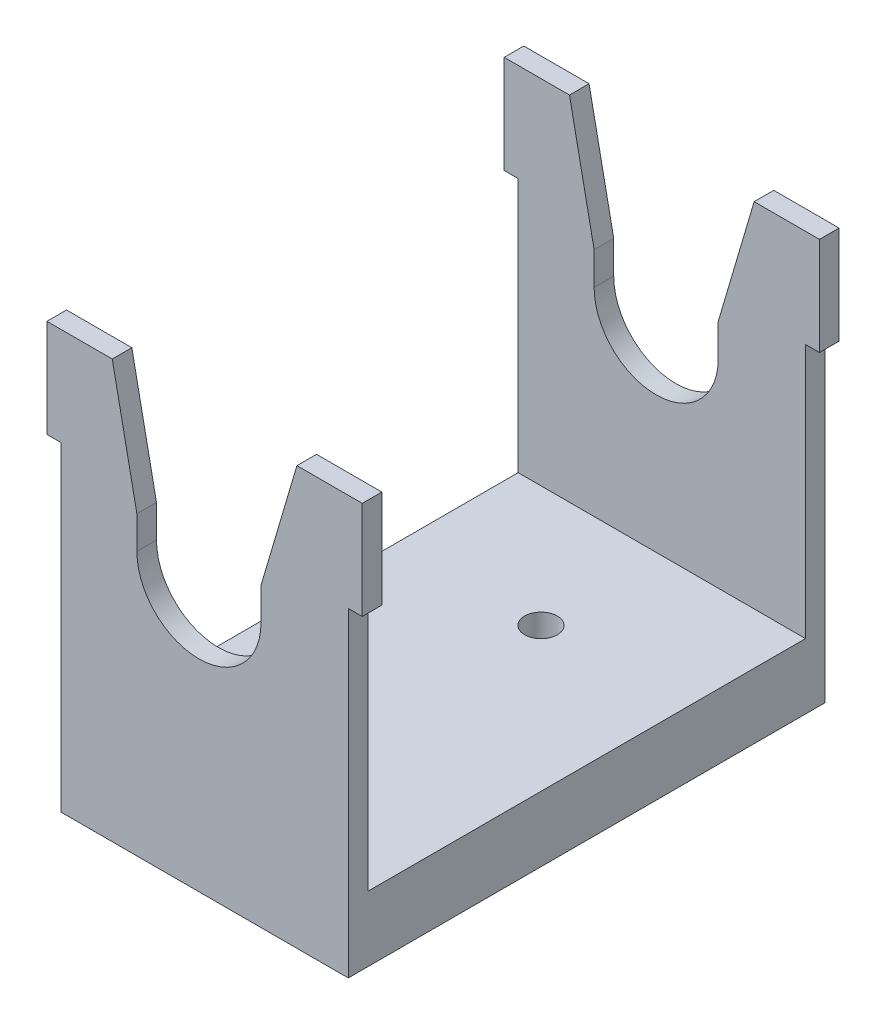
ISO-10303-21;
HEADER;
FILE_DESCRIPTION(('STEP AP214'),'2;1');
FILE_NAME('part.step','',(''),(''),'','','');
FILE_SCHEMA(('AUTOMOTIVE_DESIGN { 1 0 10303 214 1 1 1 1 }'));
ENDSEC;
DATA;
#1=APPLICATION_CONTEXT('core data for automotive mechanical design processes');
#2=APPLICATION_PROTOCOL_DEFINITION('international standard','automotive_design',2000,#1);
#3=PRODUCT_CONTEXT('',#1,'mechanical');
#4=PRODUCT('Part','Part','',(#3));
#5=PRODUCT_RELATED_PRODUCT_CATEGORY('part','',(#4));
#6=PRODUCT_DEFINITION_FORMATION('','',#4);
#7=PRODUCT_DEFINITION_CONTEXT('part definition',#1,'design');
#8=PRODUCT_DEFINITION('design','',#6,#7);
#9=PRODUCT_DEFINITION_SHAPE('','',#8);
#10=(LENGTH_UNIT() NAMED_UNIT(*) SI_UNIT(.MILLI.,.METRE.));
#11=(NAMED_UNIT(*) PLANE_ANGLE_UNIT() SI_UNIT($,.RADIAN.));
#12=(NAMED_UNIT(*) SI_UNIT($,.STERADIAN.) SOLID_ANGLE_UNIT());
#13=UNCERTAINTY_MEASURE_WITH_UNIT(LENGTH_MEASURE(1.E-05),#10,'distance_accuracy_value','');
#14=(GEOMETRIC_REPRESENTATION_CONTEXT(3) GLOBAL_UNCERTAINTY_ASSIGNED_CONTEXT((#13)) GLOBAL_UNIT_ASSIGNED_CONTEXT((#10,
#11,#12)) REPRESENTATION_CONTEXT('',''));
#15=CARTESIAN_POINT('',(0.,0.,0.));
#16=DIRECTION('',(0.,0.,1.));
#17=DIRECTION('',(1.,0.,0.));
#18=AXIS2_PLACEMENT_3D('',#15,#16,#17);
#19=CARTESIAN_POINT('',(9.84961043094934,40.3782678541206,0.));
#20=DIRECTION('',(0.,0.,-0.999999999999999));
#21=DIRECTION('',(-0.999999999999999,0.,0.));
#22=AXIS2_PLACEMENT_3D('',#19,#20,#21);
#23=PLANE('',#22);
#24=DIRECTION('',(0.,1.,0.));
#25=VECTOR('',#24,1.);
#26=CARTESIAN_POINT('',(32.7134044581614,0.,0.));
#27=LINE('',#26,#25);
#28=CARTESIAN_POINT('',(32.7134044581614,9.99999999999999,0.));
#29=VERTEX_POINT('',#28);
#30=CARTESIAN_POINT('',(32.7134044581614,49.,0.));
#31=VERTEX_POINT('',#30);
#32=EDGE_CURVE('E326',#29,#31,#27,.T.);
#33=ORIENTED_EDGE('',*,*,#32,.F.);
#34=DIRECTION('',(-0.999999999999999,0.,0.));
#35=VECTOR('',#34,1.);
#36=CARTESIAN_POINT('',(32.7134044581614,9.99999999999999,0.));
#37=LINE('',#36,#35);
#38=CARTESIAN_POINT('',(-11.2865955418386,9.99999999999998,0.));
#39=VERTEX_POINT('',#38);
#40=EDGE_CURVE('E265',#29,#39,#37,.T.);
#41=ORIENTED_EDGE('',*,*,#40,.T.);
#42=DIRECTION('',(0.,-1.,0.));
#43=VECTOR('',#42,1.);
#44=CARTESIAN_POINT('',(-11.2865955418386,49.,0.));
#45=LINE('',#44,#43);
#46=CARTESIAN_POINT('',(-11.2865955418386,49.,0.));
#47=VERTEX_POINT('',#46);
#48=EDGE_CURVE('E277',#47,#39,#45,.T.);
#49=ORIENTED_EDGE('',*,*,#48,.F.);
#50=DIRECTION('',(0.999999999999999,0.,0.));
#51=VECTOR('',#50,1.);
#52=CARTESIAN_POINT('',(-13.4228015146265,49.,0.));
#53=LINE('',#52,#51);
#54=CARTESIAN_POINT('',(-13.4228015146265,49.,0.));
#55=VERTEX_POINT('',#54);
#56=EDGE_CURVE('E283',#55,#47,#53,.T.);
#57=ORIENTED_EDGE('',*,*,#56,.F.);
#58=DIRECTION('',(0.,-1.,0.));
#59=VECTOR('',#58,1.);
#60=CARTESIAN_POINT('',(-13.4228015146265,64.,0.));
#61=LINE('',#60,#59);
#62=CARTESIAN_POINT('',(-13.4228015146265,64.,0.));
#63=VERTEX_POINT('',#62);
#64=EDGE_CURVE('E356',#63,#55,#61,.T.);
#65=ORIENTED_EDGE('',*,*,#64,.F.);
#66=DIRECTION('',(-0.999999999999999,0.,0.));
#67=VECTOR('',#66,1.);
#68=CARTESIAN_POINT('',(-13.4228015146265,64.,0.));
#69=LINE('',#68,#67);
#70=CARTESIAN_POINT('',(-3.42280151462626,64.,0.));
#71=VERTEX_POINT('',#70);
#72=EDGE_CURVE('E353',#71,#63,#69,.T.);
#73=ORIENTED_EDGE('',*,*,#72,.F.);
#74=DIRECTION('',(-0.19854799713557,0.980091165572598,0.));
#75=VECTOR('',#74,1.);
#76=CARTESIAN_POINT('',(0.349610430949276,45.3782678541206,0.));
#77=LINE('',#76,#75);
#78=CARTESIAN_POINT('',(0.349610430949276,45.3782678541206,0.));
#79=VERTEX_POINT('',#78);
#80=EDGE_CURVE('E350',#79,#71,#77,.T.);
#81=ORIENTED_EDGE('',*,*,#80,.F.);
#82=DIRECTION('',(0.,1.,0.));
#83=VECTOR('',#82,1.);
#84=CARTESIAN_POINT('',(0.349610430949276,45.3782678541206,0.));
#85=LINE('',#84,#83);
#86=CARTESIAN_POINT('',(0.349610430949276,40.3782678541206,0.));
#87=VERTEX_POINT('',#86);
#88=EDGE_CURVE('E347',#87,#79,#85,.T.);
#89=ORIENTED_EDGE('',*,*,#88,.F.);
#90=CARTESIAN_POINT('',(9.84961043094934,40.3782678541206,0.));
#91=DIRECTION('',(0.,0.,-0.999999999999999));
#92=DIRECTION('',(-0.999999999999999,0.,0.));
#93=AXIS2_PLACEMENT_3D('',#90,#91,#92);
#94=CIRCLE('',#93,9.5);
#95=CARTESIAN_POINT('',(19.3496104309494,40.3782678541206,0.));
#96=VERTEX_POINT('',#95);
#97=EDGE_CURVE('E344',#96,#87,#94,.T.);
#98=ORIENTED_EDGE('',*,*,#97,.F.);
#99=DIRECTION('',(0.,-1.,0.));
#100=VECTOR('',#99,1.);
#101=CARTESIAN_POINT('',(19.3496104309494,45.3782678541206,0.));
#102=LINE('',#101,#100);
#103=CARTESIAN_POINT('',(19.3496104309494,45.3782678541206,0.));
#104=VERTEX_POINT('',#103);
#105=EDGE_CURVE('E341',#104,#96,#102,.T.);
#106=ORIENTED_EDGE('',*,*,#105,.F.);
#107=DIRECTION('',(-0.283257308268459,-0.959043949625098,0.));
#108=VECTOR('',#107,1.);
#109=CARTESIAN_POINT('',(19.3496104309494,45.3782678541206,0.));
#110=LINE('',#109,#108);
#111=CARTESIAN_POINT('',(24.8496104309495,64.,0.));
#112=VERTEX_POINT('',#111);
#113=EDGE_CURVE('E338',#112,#104,#110,.T.);
#114=ORIENTED_EDGE('',*,*,#113,.F.);
#115=DIRECTION('',(-0.999999999999999,0.,0.));
#116=VECTOR('',#115,1.);
#117=CARTESIAN_POINT('',(34.8496104309497,64.,0.));
#118=LINE('',#117,#116);
#119=CARTESIAN_POINT('',(34.8496104309497,64.,0.));
#120=VERTEX_POINT('',#119);
#121=EDGE_CURVE('E335',#120,#112,#118,.T.);
#122=ORIENTED_EDGE('',*,*,#121,.F.);
#123=DIRECTION('',(0.,1.,0.));
#124=VECTOR('',#123,1.);
#125=CARTESIAN_POINT('',(34.8496104309497,49.,0.));
#126=LINE('',#125,#124);
#127=CARTESIAN_POINT('',(34.8496104309497,49.,0.));
#128=VERTEX_POINT('',#127);
#129=EDGE_CURVE('E332',#128,#120,#126,.T.);
#130=ORIENTED_EDGE('',*,*,#129,.F.);
#131=DIRECTION('',(0.999999999999999,0.,0.));
#132=VECTOR('',#131,1.);
#133=CARTESIAN_POINT('',(32.7134044581614,49.,0.));
#134=LINE('',#133,#132);
#135=EDGE_CURVE('E329',#31,#128,#134,.T.);
#136=ORIENTED_EDGE('',*,*,#135,.F.);
#137=EDGE_LOOP('',(#33,#41,#49,#57,#65,#73,#81,#89,#98,#106,#114,#122,#130,#136));
#138=FACE_BOUND('',#137,.T.);
#139=ADVANCED_FACE('F39',(#138),#23,.T.);
#140=CARTESIAN_POINT('',(-11.2865955418386,49.,3.));
#141=DIRECTION('',(0.999999999999999,0.,0.));
#142=DIRECTION('',(0.,1.,0.));
#143=AXIS2_PLACEMENT_3D('',#140,#141,#142);
#144=PLANE('',#143);
#145=DIRECTION('',(0.,0.,-0.999999999999999));
#146=VECTOR('',#145,1.);
#147=CARTESIAN_POINT('',(-11.2865955418382,9.99999999999997,0.));
#148=LINE('',#147,#146);
#149=CARTESIAN_POINT('',(-11.2865955418382,9.99999999999997,-66.9999999999999));
#150=VERTEX_POINT('',#149);
#151=EDGE_CURVE('E262',#39,#150,#148,.T.);
#152=ORIENTED_EDGE('',*,*,#151,.T.);
#153=DIRECTION('',(0.,-1.,0.));
#154=VECTOR('',#153,1.);
#155=CARTESIAN_POINT('',(-11.2865955418386,49.,-66.9999999999999));
#156=LINE('',#155,#154);
#157=CARTESIAN_POINT('',(-11.2865955418386,49.,-66.9999999999999));
#158=VERTEX_POINT('',#157);
#159=EDGE_CURVE('E530',#158,#150,#156,.T.);
#160=ORIENTED_EDGE('',*,*,#159,.F.);
#161=DIRECTION('',(0.,0.,-0.999999999999999));
#162=VECTOR('',#161,1.);
#163=CARTESIAN_POINT('',(-11.2865955418386,49.,-66.9999999999999));
#164=LINE('',#163,#162);
#165=CARTESIAN_POINT('',(-11.2865955418386,49.,-70.));
#166=VERTEX_POINT('',#165);
#167=EDGE_CURVE('E421',#158,#166,#164,.T.);
#168=ORIENTED_EDGE('',*,*,#167,.T.);
#169=DIRECTION('',(0.,-1.,0.));
#170=VECTOR('',#169,1.);
#171=CARTESIAN_POINT('',(-11.2865955418382,9.99999999999997,-70.));
#172=LINE('',#171,#170);
#173=CARTESIAN_POINT('',(-11.2865955418382,0.,-70.));
#174=VERTEX_POINT('',#173);
#175=EDGE_CURVE('E268',#166,#174,#172,.T.);
#176=ORIENTED_EDGE('',*,*,#175,.T.);
#177=DIRECTION('',(0.,0.,-0.999999999999999));
#178=VECTOR('',#177,1.);
#179=CARTESIAN_POINT('',(-11.2865955418382,0.,3.));
#180=LINE('',#179,#178);
#181=CARTESIAN_POINT('',(-11.2865955418382,0.,3.));
#182=VERTEX_POINT('',#181);
#183=EDGE_CURVE('E48',#182,#174,#180,.T.);
#184=ORIENTED_EDGE('',*,*,#183,.F.);
#185=DIRECTION('',(0.,-1.,0.));
#186=VECTOR('',#185,1.);
#187=CARTESIAN_POINT('',(-11.2865955418386,49.,3.));
#188=LINE('',#187,#186);
#189=CARTESIAN_POINT('',(-11.2865955418386,49.,3.));
#190=VERTEX_POINT('',#189);
#191=EDGE_CURVE('E278',#190,#182,#188,.T.);
#192=ORIENTED_EDGE('',*,*,#191,.F.);
#193=DIRECTION('',(0.,0.,-0.999999999999999));
#194=VECTOR('',#193,1.);
#195=CARTESIAN_POINT('',(-11.2865955418386,49.,3.));
#196=LINE('',#195,#194);
#197=EDGE_CURVE('E322',#190,#47,#196,.T.);
#198=ORIENTED_EDGE('',*,*,#197,.T.);
#199=ORIENTED_EDGE('',*,*,#48,.T.);
#200=EDGE_LOOP('',(#152,#160,#168,#176,#184,#192,#198,#199));
#201=FACE_BOUND('',#200,.T.);
#202=ADVANCED_FACE('F41',(#201),#144,.F.);
#203=CARTESIAN_POINT('',(-11.2865955418382,0.,3.));
#204=DIRECTION('',(0.,1.,0.));
#205=DIRECTION('',(0.,0.,0.999999999999999));
#206=AXIS2_PLACEMENT_3D('',#203,#204,#205);
#207=PLANE('',#206);
#208=CARTESIAN_POINT('',(10.7134044581616,0.,-48.4999999999999));
#209=DIRECTION('',(0.,1.,0.));
#210=DIRECTION('',(0.,0.,0.999999999999999));
#211=AXIS2_PLACEMENT_3D('',#208,#209,#210);
#212=CIRCLE('',#211,2.5);
#213=CARTESIAN_POINT('',(10.7134044581616,0.,-45.9999999999999));
#214=VERTEX_POINT('',#213);
#215=EDGE_CURVE('E540',#214,#214,#212,.T.);
#216=ORIENTED_EDGE('',*,*,#215,.T.);
#217=EDGE_LOOP('',(#216));
#218=FACE_BOUND('',#217,.T.);
#219=CARTESIAN_POINT('',(10.7134044581616,0.,-18.5));
#220=DIRECTION('',(0.,1.,0.));
#221=DIRECTION('',(0.,0.,0.999999999999999));
#222=AXIS2_PLACEMENT_3D('',#219,#220,#221);
#223=CIRCLE('',#222,2.5);
#224=CARTESIAN_POINT('',(10.7134044581616,0.,-16.));
#225=VERTEX_POINT('',#224);
#226=EDGE_CURVE('E811',#225,#225,#223,.T.);
#227=ORIENTED_EDGE('',*,*,#226,.T.);
#228=EDGE_LOOP('',(#227));
#229=FACE_BOUND('',#228,.T.);
#230=ORIENTED_EDGE('',*,*,#183,.T.);
#231=DIRECTION('',(-0.999999999999999,0.,0.));
#232=VECTOR('',#231,1.);
#233=CARTESIAN_POINT('',(32.7134044581614,0.,-69.9999999999999));
#234=LINE('',#233,#232);
#235=CARTESIAN_POINT('',(32.7134044581614,0.,-69.9999999999999));
#236=VERTEX_POINT('',#235);
#237=EDGE_CURVE('E250',#236,#174,#234,.T.);
#238=ORIENTED_EDGE('',*,*,#237,.F.);
#239=DIRECTION('',(0.,0.,-0.999999999999999));
#240=VECTOR('',#239,1.);
#241=CARTESIAN_POINT('',(32.7134044581614,0.,3.));
#242=LINE('',#241,#240);
#243=CARTESIAN_POINT('',(32.7134044581614,0.,3.));
#244=VERTEX_POINT('',#243);
#245=EDGE_CURVE('E408',#244,#236,#242,.T.);
#246=ORIENTED_EDGE('',*,*,#245,.F.);
#247=DIRECTION('',(0.999999999999999,0.,0.));
#248=VECTOR('',#247,1.);
#249=CARTESIAN_POINT('',(-11.2865955418382,0.,3.));
#250=LINE('',#249,#248);
#251=EDGE_CURVE('E282',#182,#244,#250,.T.);
#252=ORIENTED_EDGE('',*,*,#251,.F.);
#253=EDGE_LOOP('',(#230,#238,#246,#252));
#254=FACE_BOUND('',#253,.T.);
#255=ADVANCED_FACE('F414',(#218,#229,#254),#207,.F.);
#256=CARTESIAN_POINT('',(32.7134044581614,0.,3.));
#257=DIRECTION('',(-0.999999999999999,0.,0.));
#258=DIRECTION('',(0.,0.,0.999999999999999));
#259=AXIS2_PLACEMENT_3D('',#256,#257,#258);
#260=PLANE('',#259);
#261=ORIENTED_EDGE('',*,*,#245,.T.);
#262=DIRECTION('',(0.,-1.,0.));
#263=VECTOR('',#262,1.);
#264=CARTESIAN_POINT('',(32.7134044581614,9.99999999999999,-69.9999999999999));
#265=LINE('',#264,#263);
#266=CARTESIAN_POINT('',(32.7134044581614,49.,-69.9999999999999));
#267=VERTEX_POINT('',#266);
#268=EDGE_CURVE('E273',#267,#236,#265,.T.);
#269=ORIENTED_EDGE('',*,*,#268,.F.);
#270=DIRECTION('',(0.,0.,-0.999999999999999));
#271=VECTOR('',#270,1.);
#272=CARTESIAN_POINT('',(32.7134044581614,49.,-66.9999999999999));
#273=LINE('',#272,#271);
#274=CARTESIAN_POINT('',(32.7134044581614,49.,-66.9999999999999));
#275=VERTEX_POINT('',#274);
#276=EDGE_CURVE('E432',#275,#267,#273,.T.);
#277=ORIENTED_EDGE('',*,*,#276,.F.);
#278=DIRECTION('',(0.,1.,0.));
#279=VECTOR('',#278,1.);
#280=CARTESIAN_POINT('',(32.7134044581614,0.,-66.9999999999999));
#281=LINE('',#280,#279);
#282=CARTESIAN_POINT('',(32.7134044581614,9.99999999999999,-66.9999999999999));
#283=VERTEX_POINT('',#282);
#284=EDGE_CURVE('E533',#283,#275,#281,.T.);
#285=ORIENTED_EDGE('',*,*,#284,.F.);
#286=DIRECTION('',(0.,0.,-0.999999999999999));
#287=VECTOR('',#286,1.);
#288=CARTESIAN_POINT('',(32.7134044581614,9.99999999999999,0.));
#289=LINE('',#288,#287);
#290=EDGE_CURVE('E58',#29,#283,#289,.T.);
#291=ORIENTED_EDGE('',*,*,#290,.F.);
#292=ORIENTED_EDGE('',*,*,#32,.T.);
#293=DIRECTION('',(0.,0.,-0.999999999999999));
#294=VECTOR('',#293,1.);
#295=CARTESIAN_POINT('',(32.7134044581614,49.,3.));
#296=LINE('',#295,#294);
#297=CARTESIAN_POINT('',(32.7134044581614,49.,3.));
#298=VERTEX_POINT('',#297);
#299=EDGE_CURVE('E404',#298,#31,#296,.T.);
#300=ORIENTED_EDGE('',*,*,#299,.F.);
#301=DIRECTION('',(0.,1.,0.));
#302=VECTOR('',#301,1.);
#303=CARTESIAN_POINT('',(32.7134044581614,0.,3.));
#304=LINE('',#303,#302);
#305=EDGE_CURVE('E286',#244,#298,#304,.T.);
#306=ORIENTED_EDGE('',*,*,#305,.F.);
#307=EDGE_LOOP('',(#261,#269,#277,#285,#291,#292,#300,#306));
#308=FACE_BOUND('',#307,.T.);
#309=ADVANCED_FACE('F430',(#308),#260,.F.);
#310=CARTESIAN_POINT('',(32.7134044581614,49.,3.));
#311=DIRECTION('',(0.,1.,0.));
#312=DIRECTION('',(0.,0.,0.999999999999999));
#313=AXIS2_PLACEMENT_3D('',#310,#311,#312);
#314=PLANE('',#313);
#315=ORIENTED_EDGE('',*,*,#135,.T.);
#316=DIRECTION('',(0.,0.,-0.999999999999999));
#317=VECTOR('',#316,1.);
#318=CARTESIAN_POINT('',(34.8496104309497,49.,3.));
#319=LINE('',#318,#317);
#320=CARTESIAN_POINT('',(34.8496104309497,49.,3.));
#321=VERTEX_POINT('',#320);
#322=EDGE_CURVE('E400',#321,#128,#319,.T.);
#323=ORIENTED_EDGE('',*,*,#322,.F.);
#324=DIRECTION('',(0.999999999999999,0.,0.));
#325=VECTOR('',#324,1.);
#326=CARTESIAN_POINT('',(32.7134044581614,49.,3.));
#327=LINE('',#326,#325);
#328=EDGE_CURVE('E289',#298,#321,#327,.T.);
#329=ORIENTED_EDGE('',*,*,#328,.F.);
#330=ORIENTED_EDGE('',*,*,#299,.T.);
#331=EDGE_LOOP('',(#315,#323,#329,#330));
#332=FACE_BOUND('',#331,.T.);
#333=ADVANCED_FACE('F579',(#332),#314,.F.);
#334=CARTESIAN_POINT('',(34.8496104309497,49.,3.));
#335=DIRECTION('',(-0.999999999999999,0.,0.));
#336=DIRECTION('',(0.,0.,0.999999999999999));
#337=AXIS2_PLACEMENT_3D('',#334,#335,#336);
#338=PLANE('',#337);
#339=ORIENTED_EDGE('',*,*,#129,.T.);
#340=DIRECTION('',(0.,0.,-0.999999999999999));
#341=VECTOR('',#340,1.);
#342=CARTESIAN_POINT('',(34.8496104309497,64.,3.));
#343=LINE('',#342,#341);
#344=CARTESIAN_POINT('',(34.8496104309497,64.,3.));
#345=VERTEX_POINT('',#344);
#346=EDGE_CURVE('E396',#345,#120,#343,.T.);
#347=ORIENTED_EDGE('',*,*,#346,.F.);
#348=DIRECTION('',(0.,1.,0.));
#349=VECTOR('',#348,1.);
#350=CARTESIAN_POINT('',(34.8496104309497,49.,3.));
#351=LINE('',#350,#349);
#352=EDGE_CURVE('E292',#321,#345,#351,.T.);
#353=ORIENTED_EDGE('',*,*,#352,.F.);
#354=ORIENTED_EDGE('',*,*,#322,.T.);
#355=EDGE_LOOP('',(#339,#347,#353,#354));
#356=FACE_BOUND('',#355,.T.);
#357=ADVANCED_FACE('F630',(#356),#338,.F.);
#358=CARTESIAN_POINT('',(34.8496104309497,64.,3.));
#359=DIRECTION('',(0.,-1.,0.));
#360=DIRECTION('',(0.,0.,-0.999999999999999));
#361=AXIS2_PLACEMENT_3D('',#358,#359,#360);
#362=PLANE('',#361);
#363=ORIENTED_EDGE('',*,*,#121,.T.);
#364=DIRECTION('',(0.,0.,-0.999999999999999));
#365=VECTOR('',#364,1.);
#366=CARTESIAN_POINT('',(24.8496104309495,64.,3.));
#367=LINE('',#366,#365);
#368=CARTESIAN_POINT('',(24.8496104309495,64.,3.));
#369=VERTEX_POINT('',#368);
#370=EDGE_CURVE('E392',#369,#112,#367,.T.);
#371=ORIENTED_EDGE('',*,*,#370,.F.);
#372=DIRECTION('',(-0.999999999999999,0.,0.));
#373=VECTOR('',#372,1.);
#374=CARTESIAN_POINT('',(34.8496104309497,64.,3.));
#375=LINE('',#374,#373);
#376=EDGE_CURVE('E295',#345,#369,#375,.T.);
#377=ORIENTED_EDGE('',*,*,#376,.F.);
#378=ORIENTED_EDGE('',*,*,#346,.T.);
#379=EDGE_LOOP('',(#363,#371,#377,#378));
#380=FACE_BOUND('',#379,.T.);
#381=ADVANCED_FACE('F628',(#380),#362,.F.);
#382=CARTESIAN_POINT('',(19.3496104309494,45.3782678541206,3.));
#383=DIRECTION('',(0.959043949625097,-0.28325730826846,0.));
#384=DIRECTION('',(0.283257308268459,0.959043949625098,0.));
#385=AXIS2_PLACEMENT_3D('',#382,#383,#384);
#386=PLANE('',#385);
#387=ORIENTED_EDGE('',*,*,#113,.T.);
#388=DIRECTION('',(0.,0.,-0.999999999999999));
#389=VECTOR('',#388,1.);
#390=CARTESIAN_POINT('',(19.3496104309494,45.3782678541206,3.));
#391=LINE('',#390,#389);
#392=CARTESIAN_POINT('',(19.3496104309494,45.3782678541206,3.));
#393=VERTEX_POINT('',#392);
#394=EDGE_CURVE('E388',#393,#104,#391,.T.);
#395=ORIENTED_EDGE('',*,*,#394,.F.);
#396=DIRECTION('',(-0.283257308268459,-0.959043949625098,0.));
#397=VECTOR('',#396,1.);
#398=CARTESIAN_POINT('',(19.3496104309494,45.3782678541206,3.));
#399=LINE('',#398,#397);
#400=EDGE_CURVE('E298',#369,#393,#399,.T.);
#401=ORIENTED_EDGE('',*,*,#400,.F.);
#402=ORIENTED_EDGE('',*,*,#370,.T.);
#403=EDGE_LOOP('',(#387,#395,#401,#402));
#404=FACE_BOUND('',#403,.T.);
#405=ADVANCED_FACE('F623',(#404),#386,.F.);
#406=CARTESIAN_POINT('',(19.3496104309494,45.3782678541206,3.));
#407=DIRECTION('',(0.999999999999999,0.,0.));
#408=DIRECTION('',(0.,0.,-0.999999999999999));
#409=AXIS2_PLACEMENT_3D('',#406,#407,#408);
#410=PLANE('',#409);
#411=ORIENTED_EDGE('',*,*,#105,.T.);
#412=DIRECTION('',(0.,0.,-0.999999999999999));
#413=VECTOR('',#412,1.);
#414=CARTESIAN_POINT('',(19.3496104309494,40.3782678541206,3.));
#415=LINE('',#414,#413);
#416=CARTESIAN_POINT('',(19.3496104309494,40.3782678541206,3.));
#417=VERTEX_POINT('',#416);
#418=EDGE_CURVE('E384',#417,#96,#415,.T.);
#419=ORIENTED_EDGE('',*,*,#418,.F.);
#420=DIRECTION('',(0.,-1.,0.));
#421=VECTOR('',#420,1.);
#422=CARTESIAN_POINT('',(19.3496104309494,45.3782678541206,3.));
#423=LINE('',#422,#421);
#424=EDGE_CURVE('E301',#393,#417,#423,.T.);
#425=ORIENTED_EDGE('',*,*,#424,.F.);
#426=ORIENTED_EDGE('',*,*,#394,.T.);
#427=EDGE_LOOP('',(#411,#419,#425,#426));
#428=FACE_BOUND('',#427,.T.);
#429=ADVANCED_FACE('F618',(#428),#410,.F.);
#430=CARTESIAN_POINT('',(9.84961043094934,40.3782678541206,3.));
#431=DIRECTION('',(0.,0.,-0.999999999999999));
#432=DIRECTION('',(-0.999999999999999,0.,0.));
#433=AXIS2_PLACEMENT_3D('',#430,#431,#432);
#434=CYLINDRICAL_SURFACE('',#433,9.5);
#435=ORIENTED_EDGE('',*,*,#97,.T.);
#436=DIRECTION('',(0.,0.,-0.999999999999999));
#437=VECTOR('',#436,1.);
#438=CARTESIAN_POINT('',(0.349610430949276,40.3782678541206,3.));
#439=LINE('',#438,#437);
#440=CARTESIAN_POINT('',(0.349610430949276,40.3782678541206,3.));
#441=VERTEX_POINT('',#440);
#442=EDGE_CURVE('E380',#441,#87,#439,.T.);
#443=ORIENTED_EDGE('',*,*,#442,.F.);
#444=CARTESIAN_POINT('',(9.84961043094934,40.3782678541206,3.));
#445=DIRECTION('',(0.,0.,-0.999999999999999));
#446=DIRECTION('',(-0.999999999999999,0.,0.));
#447=AXIS2_PLACEMENT_3D('',#444,#445,#446);
#448=CIRCLE('',#447,9.5);
#449=EDGE_CURVE('E304',#417,#441,#448,.T.);
#450=ORIENTED_EDGE('',*,*,#449,.F.);
#451=ORIENTED_EDGE('',*,*,#418,.T.);
#452=EDGE_LOOP('',(#435,#443,#450,#451));
#453=FACE_BOUND('',#452,.T.);
#454=ADVANCED_FACE('F614',(#453),#434,.F.);
#455=CARTESIAN_POINT('',(0.349610430949276,45.3782678541206,3.));
#456=DIRECTION('',(-0.999999999999999,0.,0.));
#457=DIRECTION('',(0.,-1.,0.));
#458=AXIS2_PLACEMENT_3D('',#455,#456,#457);
#459=PLANE('',#458);
#460=ORIENTED_EDGE('',*,*,#88,.T.);
#461=DIRECTION('',(0.,0.,-0.999999999999999));
#462=VECTOR('',#461,1.);
#463=CARTESIAN_POINT('',(0.349610430949276,45.3782678541206,3.));
#464=LINE('',#463,#462);
#465=CARTESIAN_POINT('',(0.349610430949276,45.3782678541206,3.));
#466=VERTEX_POINT('',#465);
#467=EDGE_CURVE('E376',#466,#79,#464,.T.);
#468=ORIENTED_EDGE('',*,*,#467,.F.);
#469=DIRECTION('',(0.,1.,0.));
#470=VECTOR('',#469,1.);
#471=CARTESIAN_POINT('',(0.349610430949276,45.3782678541206,3.));
#472=LINE('',#471,#470);
#473=EDGE_CURVE('E307',#441,#466,#472,.T.);
#474=ORIENTED_EDGE('',*,*,#473,.F.);
#475=ORIENTED_EDGE('',*,*,#442,.T.);
#476=EDGE_LOOP('',(#460,#468,#474,#475));
#477=FACE_BOUND('',#476,.T.);
#478=ADVANCED_FACE('F609',(#477),#459,.F.);
#479=CARTESIAN_POINT('',(0.349610430949276,45.3782678541206,3.));
#480=DIRECTION('',(-0.980091165572597,-0.19854799713557,0.));
#481=DIRECTION('',(0.19854799713557,-0.980091165572598,0.));
#482=AXIS2_PLACEMENT_3D('',#479,#480,#481);
#483=PLANE('',#482);
#484=ORIENTED_EDGE('',*,*,#80,.T.);
#485=DIRECTION('',(0.,0.,-0.999999999999999));
#486=VECTOR('',#485,1.);
#487=CARTESIAN_POINT('',(-3.42280151462626,64.,3.));
#488=LINE('',#487,#486);
#489=CARTESIAN_POINT('',(-3.42280151462626,64.,3.));
#490=VERTEX_POINT('',#489);
#491=EDGE_CURVE('E372',#490,#71,#488,.T.);
#492=ORIENTED_EDGE('',*,*,#491,.F.);
#493=DIRECTION('',(-0.19854799713557,0.980091165572598,0.));
#494=VECTOR('',#493,1.);
#495=CARTESIAN_POINT('',(0.349610430949276,45.3782678541206,3.));
#496=LINE('',#495,#494);
#497=EDGE_CURVE('E310',#466,#490,#496,.T.);
#498=ORIENTED_EDGE('',*,*,#497,.F.);
#499=ORIENTED_EDGE('',*,*,#467,.T.);
#500=EDGE_LOOP('',(#484,#492,#498,#499));
#501=FACE_BOUND('',#500,.T.);
#502=ADVANCED_FACE('F603',(#501),#483,.F.);
#503=CARTESIAN_POINT('',(-13.4228015146265,64.,2.99999999999995));
#504=DIRECTION('',(0.,-1.,0.));
#505=DIRECTION('',(0.,0.,-0.999999999999999));
#506=AXIS2_PLACEMENT_3D('',#503,#504,#505);
#507=PLANE('',#506);
#508=ORIENTED_EDGE('',*,*,#72,.T.);
#509=DIRECTION('',(0.,0.,-0.999999999999999));
#510=VECTOR('',#509,1.);
#511=CARTESIAN_POINT('',(-13.4228015146265,64.,2.99999999999995));
#512=LINE('',#511,#510);
#513=CARTESIAN_POINT('',(-13.4228015146265,64.,2.99999999999995));
#514=VERTEX_POINT('',#513);
#515=EDGE_CURVE('E368',#514,#63,#512,.T.);
#516=ORIENTED_EDGE('',*,*,#515,.F.);
#517=DIRECTION('',(-0.999999999999999,0.,0.));
#518=VECTOR('',#517,1.);
#519=CARTESIAN_POINT('',(-13.4228015146265,64.,2.99999999999995));
#520=LINE('',#519,#518);
#521=EDGE_CURVE('E313',#490,#514,#520,.T.);
#522=ORIENTED_EDGE('',*,*,#521,.F.);
#523=ORIENTED_EDGE('',*,*,#491,.T.);
#524=EDGE_LOOP('',(#508,#516,#522,#523));
#525=FACE_BOUND('',#524,.T.);
#526=ADVANCED_FACE('F599',(#525),#507,.F.);
#527=CARTESIAN_POINT('',(-13.4228015146265,64.,2.99999999999995));
#528=DIRECTION('',(0.999999999999999,0.,0.));
#529=DIRECTION('',(0.,0.,-0.999999999999999));
#530=AXIS2_PLACEMENT_3D('',#527,#528,#529);
#531=PLANE('',#530);
#532=ORIENTED_EDGE('',*,*,#64,.T.);
#533=DIRECTION('',(0.,0.,-0.999999999999999));
#534=VECTOR('',#533,1.);
#535=CARTESIAN_POINT('',(-13.4228015146265,49.,2.99999999999998));
#536=LINE('',#535,#534);
#537=CARTESIAN_POINT('',(-13.4228015146265,49.,2.99999999999998));
#538=VERTEX_POINT('',#537);
#539=EDGE_CURVE('E364',#538,#55,#536,.T.);
#540=ORIENTED_EDGE('',*,*,#539,.F.);
#541=DIRECTION('',(0.,-1.,0.));
#542=VECTOR('',#541,1.);
#543=CARTESIAN_POINT('',(-13.4228015146265,64.,2.99999999999995));
#544=LINE('',#543,#542);
#545=EDGE_CURVE('E316',#514,#538,#544,.T.);
#546=ORIENTED_EDGE('',*,*,#545,.F.);
#547=ORIENTED_EDGE('',*,*,#515,.T.);
#548=EDGE_LOOP('',(#532,#540,#546,#547));
#549=FACE_BOUND('',#548,.T.);
#550=ADVANCED_FACE('F594',(#549),#531,.F.);
#551=CARTESIAN_POINT('',(-13.4228015146265,49.,2.99999999999998));
#552=DIRECTION('',(0.,1.,0.));
#553=DIRECTION('',(0.,0.,0.999999999999999));
#554=AXIS2_PLACEMENT_3D('',#551,#552,#553);
#555=PLANE('',#554);
#556=ORIENTED_EDGE('',*,*,#56,.T.);
#557=ORIENTED_EDGE('',*,*,#197,.F.);
#558=DIRECTION('',(0.999999999999999,0.,0.));
#559=VECTOR('',#558,1.);
#560=CARTESIAN_POINT('',(-13.4228015146265,49.,2.99999999999998));
#561=LINE('',#560,#559);
#562=EDGE_CURVE('E319',#538,#190,#561,.T.);
#563=ORIENTED_EDGE('',*,*,#562,.F.);
#564=ORIENTED_EDGE('',*,*,#539,.T.);
#565=EDGE_LOOP('',(#556,#557,#563,#564));
#566=FACE_BOUND('',#565,.T.);
#567=ADVANCED_FACE('F588',(#566),#555,.F.);
#568=CARTESIAN_POINT('',(9.84961043094934,40.3782678541206,3.));
#569=DIRECTION('',(0.,0.,-0.999999999999999));
#570=DIRECTION('',(-0.999999999999999,0.,0.));
#571=AXIS2_PLACEMENT_3D('',#568,#569,#570);
#572=PLANE('',#571);
#573=ORIENTED_EDGE('',*,*,#191,.T.);
#574=ORIENTED_EDGE('',*,*,#251,.T.);
#575=ORIENTED_EDGE('',*,*,#305,.T.);
#576=ORIENTED_EDGE('',*,*,#328,.T.);
#577=ORIENTED_EDGE('',*,*,#352,.T.);
#578=ORIENTED_EDGE('',*,*,#376,.T.);
#579=ORIENTED_EDGE('',*,*,#400,.T.);
#580=ORIENTED_EDGE('',*,*,#424,.T.);
#581=ORIENTED_EDGE('',*,*,#449,.T.);
#582=ORIENTED_EDGE('',*,*,#473,.T.);
#583=ORIENTED_EDGE('',*,*,#497,.T.);
#584=ORIENTED_EDGE('',*,*,#521,.T.);
#585=ORIENTED_EDGE('',*,*,#545,.T.);
#586=ORIENTED_EDGE('',*,*,#562,.T.);
#587=EDGE_LOOP('',(#573,#574,#575,#576,#577,#578,#579,#580,#581,#582,#583,#584,#585,#586));
#588=FACE_BOUND('',#587,.T.);
#589=ADVANCED_FACE('F583',(#588),#572,.F.);
#590=CARTESIAN_POINT('',(32.7134044581614,9.99999999999999,-69.9999999999999));
#591=DIRECTION('',(0.,0.,0.999999999999999));
#592=DIRECTION('',(0.999999999999999,0.,0.));
#593=AXIS2_PLACEMENT_3D('',#590,#591,#592);
#594=PLANE('',#593);
#595=ORIENTED_EDGE('',*,*,#237,.T.);
#596=ORIENTED_EDGE('',*,*,#175,.F.);
#597=DIRECTION('',(0.999999999999999,0.,0.));
#598=VECTOR('',#597,1.);
#599=CARTESIAN_POINT('',(-13.4228015146265,49.,-70.));
#600=LINE('',#599,#598);
#601=CARTESIAN_POINT('',(-13.4228015146265,49.,-70.));
#602=VERTEX_POINT('',#601);
#603=EDGE_CURVE('E505',#602,#166,#600,.T.);
#604=ORIENTED_EDGE('',*,*,#603,.F.);
#605=DIRECTION('',(0.,-1.,0.));
#606=VECTOR('',#605,1.);
#607=CARTESIAN_POINT('',(-13.4228015146265,64.,-70.));
#608=LINE('',#607,#606);
#609=CARTESIAN_POINT('',(-13.4228015146265,64.,-70.));
#610=VERTEX_POINT('',#609);
#611=EDGE_CURVE('E502',#610,#602,#608,.T.);
#612=ORIENTED_EDGE('',*,*,#611,.F.);
#613=DIRECTION('',(-0.999999999999999,0.,0.));
#614=VECTOR('',#613,1.);
#615=CARTESIAN_POINT('',(-3.42280151462626,64.,-69.9999999999999));
#616=LINE('',#615,#614);
#617=CARTESIAN_POINT('',(-3.42280151462626,64.,-69.9999999999999));
#618=VERTEX_POINT('',#617);
#619=EDGE_CURVE('E499',#618,#610,#616,.T.);
#620=ORIENTED_EDGE('',*,*,#619,.F.);
#621=DIRECTION('',(-0.19854799713557,0.980091165572598,0.));
#622=VECTOR('',#621,1.);
#623=CARTESIAN_POINT('',(0.349610430949276,45.3782678541206,-69.9999999999999));
#624=LINE('',#623,#622);
#625=CARTESIAN_POINT('',(0.349610430949276,45.3782678541206,-69.9999999999999));
#626=VERTEX_POINT('',#625);
#627=EDGE_CURVE('E496',#626,#618,#624,.T.);
#628=ORIENTED_EDGE('',*,*,#627,.F.);
#629=DIRECTION('',(0.,1.,0.));
#630=VECTOR('',#629,1.);
#631=CARTESIAN_POINT('',(0.349610430949276,40.3782678541206,-69.9999999999999));
#632=LINE('',#631,#630);
#633=CARTESIAN_POINT('',(0.349610430949276,40.3782678541206,-69.9999999999999));
#634=VERTEX_POINT('',#633);
#635=EDGE_CURVE('E488',#634,#626,#632,.T.);
#636=ORIENTED_EDGE('',*,*,#635,.F.);
#637=CARTESIAN_POINT('',(9.84961043094934,40.3782678541206,-69.9999999999999));
#638=DIRECTION('',(0.,0.,-0.999999999999999));
#639=DIRECTION('',(0.999999999999999,0.,0.));
#640=AXIS2_PLACEMENT_3D('',#637,#638,#639);
#641=CIRCLE('',#640,9.5);
#642=CARTESIAN_POINT('',(19.3496104309494,40.3782678541206,-70.));
#643=VERTEX_POINT('',#642);
#644=EDGE_CURVE('E483',#643,#634,#641,.T.);
#645=ORIENTED_EDGE('',*,*,#644,.F.);
#646=DIRECTION('',(0.,-1.,0.));
#647=VECTOR('',#646,1.);
#648=CARTESIAN_POINT('',(19.3496104309494,45.3782678541206,-70.));
#649=LINE('',#648,#647);
#650=CARTESIAN_POINT('',(19.3496104309494,45.3782678541206,-70.));
#651=VERTEX_POINT('',#650);
#652=EDGE_CURVE('E476',#651,#643,#649,.T.);
#653=ORIENTED_EDGE('',*,*,#652,.F.);
#654=DIRECTION('',(-0.283257308268459,-0.959043949625098,0.));
#655=VECTOR('',#654,1.);
#656=CARTESIAN_POINT('',(24.8496104309495,64.,-69.9999999999999));
#657=LINE('',#656,#655);
#658=CARTESIAN_POINT('',(24.8496104309495,64.,-69.9999999999999));
#659=VERTEX_POINT('',#658);
#660=EDGE_CURVE('E481',#659,#651,#657,.T.);
#661=ORIENTED_EDGE('',*,*,#660,.F.);
#662=DIRECTION('',(-0.999999999999999,0.,0.));
#663=VECTOR('',#662,1.);
#664=CARTESIAN_POINT('',(34.8496104309497,64.,-69.9999999999999));
#665=LINE('',#664,#663);
#666=CARTESIAN_POINT('',(34.8496104309497,64.,-69.9999999999999));
#667=VERTEX_POINT('',#666);
#668=EDGE_CURVE('E490',#667,#659,#665,.T.);
#669=ORIENTED_EDGE('',*,*,#668,.F.);
#670=DIRECTION('',(0.,1.,0.));
#671=VECTOR('',#670,1.);
#672=CARTESIAN_POINT('',(34.8496104309497,49.,-69.9999999999999));
#673=LINE('',#672,#671);
#674=CARTESIAN_POINT('',(34.8496104309497,49.,-69.9999999999999));
#675=VERTEX_POINT('',#674);
#676=EDGE_CURVE('E248',#675,#667,#673,.T.);
#677=ORIENTED_EDGE('',*,*,#676,.F.);
#678=DIRECTION('',(0.999999999999999,0.,0.));
#679=VECTOR('',#678,1.);
#680=CARTESIAN_POINT('',(32.7134044581614,49.,-69.9999999999999));
#681=LINE('',#680,#679);
#682=EDGE_CURVE('E244',#267,#675,#681,.T.);
#683=ORIENTED_EDGE('',*,*,#682,.F.);
#684=ORIENTED_EDGE('',*,*,#268,.T.);
#685=EDGE_LOOP('',(#595,#596,#604,#612,#620,#628,#636,#645,#653,#661,#669,#677,#683,#684));
#686=FACE_BOUND('',#685,.T.);
#687=ADVANCED_FACE('F425',(#686),#594,.F.);
#688=CARTESIAN_POINT('',(0.,9.99999999999999,0.));
#689=DIRECTION('',(0.,1.,0.));
#690=DIRECTION('',(0.,0.,0.999999999999999));
#691=AXIS2_PLACEMENT_3D('',#688,#689,#690);
#692=PLANE('',#691);
#693=CARTESIAN_POINT('',(10.7134044581616,10.,-48.4999999999999));
#694=DIRECTION('',(0.,1.,0.));
#695=DIRECTION('',(0.,0.,0.999999999999999));
#696=AXIS2_PLACEMENT_3D('',#693,#694,#695);
#697=CIRCLE('',#696,2.5);
#698=CARTESIAN_POINT('',(10.7134044581616,10.,-45.9999999999999));
#699=VERTEX_POINT('',#698);
#700=EDGE_CURVE('E809',#699,#699,#697,.T.);
#701=ORIENTED_EDGE('',*,*,#700,.F.);
#702=EDGE_LOOP('',(#701));
#703=FACE_BOUND('',#702,.T.);
#704=CARTESIAN_POINT('',(10.7134044581616,10.,-18.5));
#705=DIRECTION('',(0.,1.,0.));
#706=DIRECTION('',(0.,0.,0.999999999999999));
#707=AXIS2_PLACEMENT_3D('',#704,#705,#706);
#708=CIRCLE('',#707,2.5);
#709=CARTESIAN_POINT('',(10.7134044581616,10.,-16.));
#710=VERTEX_POINT('',#709);
#711=EDGE_CURVE('E817',#710,#710,#708,.T.);
#712=ORIENTED_EDGE('',*,*,#711,.F.);
#713=EDGE_LOOP('',(#712));
#714=FACE_BOUND('',#713,.T.);
#715=DIRECTION('',(0.999999999999999,0.,0.));
#716=VECTOR('',#715,1.);
#717=CARTESIAN_POINT('',(0.,9.99999999999999,-66.9999999999999));
#718=LINE('',#717,#716);
#719=EDGE_CURVE('E11',#150,#283,#718,.T.);
#720=ORIENTED_EDGE('',*,*,#719,.F.);
#721=ORIENTED_EDGE('',*,*,#151,.F.);
#722=ORIENTED_EDGE('',*,*,#40,.F.);
#723=ORIENTED_EDGE('',*,*,#290,.T.);
#724=EDGE_LOOP('',(#720,#721,#722,#723));
#725=FACE_BOUND('',#724,.T.);
#726=ADVANCED_FACE('F570',(#703,#714,#725),#692,.T.);
#727=CARTESIAN_POINT('',(34.8496104309497,49.,-66.9999999999999));
#728=DIRECTION('',(-0.999999999999999,0.,0.));
#729=DIRECTION('',(0.,0.,0.999999999999999));
#730=AXIS2_PLACEMENT_3D('',#727,#728,#729);
#731=PLANE('',#730);
#732=ORIENTED_EDGE('',*,*,#676,.T.);
#733=DIRECTION('',(0.,0.,-0.999999999999999));
#734=VECTOR('',#733,1.);
#735=CARTESIAN_POINT('',(34.8496104309497,64.,-66.9999999999999));
#736=LINE('',#735,#734);
#737=CARTESIAN_POINT('',(34.8496104309497,64.,-66.9999999999999));
#738=VERTEX_POINT('',#737);
#739=EDGE_CURVE('E225',#738,#667,#736,.T.);
#740=ORIENTED_EDGE('',*,*,#739,.F.);
#741=DIRECTION('',(0.,1.,0.));
#742=VECTOR('',#741,1.);
#743=CARTESIAN_POINT('',(34.8496104309497,49.,-66.9999999999999));
#744=LINE('',#743,#742);
#745=CARTESIAN_POINT('',(34.8496104309497,49.,-66.9999999999999));
#746=VERTEX_POINT('',#745);
#747=EDGE_CURVE('E233',#746,#738,#744,.T.);
#748=ORIENTED_EDGE('',*,*,#747,.F.);
#749=DIRECTION('',(0.,0.,-0.999999999999999));
#750=VECTOR('',#749,1.);
#751=CARTESIAN_POINT('',(34.8496104309497,49.,-66.9999999999999));
#752=LINE('',#751,#750);
#753=EDGE_CURVE('E437',#746,#675,#752,.T.);
#754=ORIENTED_EDGE('',*,*,#753,.T.);
#755=EDGE_LOOP('',(#732,#740,#748,#754));
#756=FACE_BOUND('',#755,.T.);
#757=ADVANCED_FACE('F246',(#756),#731,.F.);
#758=CARTESIAN_POINT('',(34.8496104309497,64.,-66.9999999999999));
#759=DIRECTION('',(0.,-1.,0.));
#760=DIRECTION('',(0.,0.,-0.999999999999999));
#761=AXIS2_PLACEMENT_3D('',#758,#759,#760);
#762=PLANE('',#761);
#763=ORIENTED_EDGE('',*,*,#668,.T.);
#764=DIRECTION('',(0.,0.,-0.999999999999999));
#765=VECTOR('',#764,1.);
#766=CARTESIAN_POINT('',(24.8496104309495,64.,-66.9999999999999));
#767=LINE('',#766,#765);
#768=CARTESIAN_POINT('',(24.8496104309495,64.,-66.9999999999999));
#769=VERTEX_POINT('',#768);
#770=EDGE_CURVE('E228',#769,#659,#767,.T.);
#771=ORIENTED_EDGE('',*,*,#770,.F.);
#772=DIRECTION('',(-0.999999999999999,0.,0.));
#773=VECTOR('',#772,1.);
#774=CARTESIAN_POINT('',(34.8496104309497,64.,-66.9999999999999));
#775=LINE('',#774,#773);
#776=EDGE_CURVE('E221',#738,#769,#775,.T.);
#777=ORIENTED_EDGE('',*,*,#776,.F.);
#778=ORIENTED_EDGE('',*,*,#739,.T.);
#779=EDGE_LOOP('',(#763,#771,#777,#778));
#780=FACE_BOUND('',#779,.T.);
#781=ADVANCED_FACE('F223',(#780),#762,.F.);
#782=CARTESIAN_POINT('',(24.8496104309495,64.,-66.9999999999999));
#783=DIRECTION('',(0.959043949625097,-0.28325730826846,0.));
#784=DIRECTION('',(0.283257308268459,0.959043949625098,0.));
#785=AXIS2_PLACEMENT_3D('',#782,#783,#784);
#786=PLANE('',#785);
#787=ORIENTED_EDGE('',*,*,#660,.T.);
#788=DIRECTION('',(0.,0.,-0.999999999999999));
#789=VECTOR('',#788,1.);
#790=CARTESIAN_POINT('',(19.3496104309494,45.3782678541206,-66.9999999999999));
#791=LINE('',#790,#789);
#792=CARTESIAN_POINT('',(19.3496104309494,45.3782678541206,-66.9999999999999));
#793=VERTEX_POINT('',#792);
#794=EDGE_CURVE('E256',#793,#651,#791,.T.);
#795=ORIENTED_EDGE('',*,*,#794,.F.);
#796=DIRECTION('',(-0.283257308268459,-0.959043949625098,0.));
#797=VECTOR('',#796,1.);
#798=CARTESIAN_POINT('',(24.8496104309495,64.,-66.9999999999999));
#799=LINE('',#798,#797);
#800=EDGE_CURVE('E232',#769,#793,#799,.T.);
#801=ORIENTED_EDGE('',*,*,#800,.F.);
#802=ORIENTED_EDGE('',*,*,#770,.T.);
#803=EDGE_LOOP('',(#787,#795,#801,#802));
#804=FACE_BOUND('',#803,.T.);
#805=ADVANCED_FACE('F542',(#804),#786,.F.);
#806=CARTESIAN_POINT('',(19.3496104309494,45.3782678541206,-66.9999999999999));
#807=DIRECTION('',(0.999999999999999,0.,0.));
#808=DIRECTION('',(0.,0.,-0.999999999999999));
#809=AXIS2_PLACEMENT_3D('',#806,#807,#808);
#810=PLANE('',#809);
#811=ORIENTED_EDGE('',*,*,#652,.T.);
#812=DIRECTION('',(0.,0.,-0.999999999999999));
#813=VECTOR('',#812,1.);
#814=CARTESIAN_POINT('',(19.3496104309494,40.3782678541206,-66.9999999999999));
#815=LINE('',#814,#813);
#816=CARTESIAN_POINT('',(19.3496104309494,40.3782678541206,-66.9999999999999));
#817=VERTEX_POINT('',#816);
#818=EDGE_CURVE('E465',#817,#643,#815,.T.);
#819=ORIENTED_EDGE('',*,*,#818,.F.);
#820=DIRECTION('',(0.,-1.,0.));
#821=VECTOR('',#820,1.);
#822=CARTESIAN_POINT('',(19.3496104309494,45.3782678541206,-66.9999999999999));
#823=LINE('',#822,#821);
#824=EDGE_CURVE('E477',#793,#817,#823,.T.);
#825=ORIENTED_EDGE('',*,*,#824,.F.);
#826=ORIENTED_EDGE('',*,*,#794,.T.);
#827=EDGE_LOOP('',(#811,#819,#825,#826));
#828=FACE_BOUND('',#827,.T.);
#829=ADVANCED_FACE('F474',(#828),#810,.F.);
#830=CARTESIAN_POINT('',(9.84961043094934,40.3782678541206,-66.9999999999999));
#831=DIRECTION('',(0.,0.,-0.999999999999999));
#832=DIRECTION('',(-0.999999999999999,0.,0.));
#833=AXIS2_PLACEMENT_3D('',#830,#831,#832);
#834=CYLINDRICAL_SURFACE('',#833,9.5);
#835=ORIENTED_EDGE('',*,*,#644,.T.);
#836=DIRECTION('',(0.,0.,-0.999999999999999));
#837=VECTOR('',#836,1.);
#838=CARTESIAN_POINT('',(0.349610430949276,40.3782678541206,-66.9999999999999));
#839=LINE('',#838,#837);
#840=CARTESIAN_POINT('',(0.349610430949276,40.3782678541206,-66.9999999999999));
#841=VERTEX_POINT('',#840);
#842=EDGE_CURVE('E461',#841,#634,#839,.T.);
#843=ORIENTED_EDGE('',*,*,#842,.F.);
#844=CARTESIAN_POINT('',(9.84961043094934,40.3782678541206,-66.9999999999999));
#845=DIRECTION('',(0.,0.,-0.999999999999999));
#846=DIRECTION('',(0.999999999999999,0.,0.));
#847=AXIS2_PLACEMENT_3D('',#844,#845,#846);
#848=CIRCLE('',#847,9.5);
#849=EDGE_CURVE('E512',#817,#841,#848,.T.);
#850=ORIENTED_EDGE('',*,*,#849,.F.);
#851=ORIENTED_EDGE('',*,*,#818,.T.);
#852=EDGE_LOOP('',(#835,#843,#850,#851));
#853=FACE_BOUND('',#852,.T.);
#854=ADVANCED_FACE('F546',(#853),#834,.F.);
#855=CARTESIAN_POINT('',(0.349610430949276,40.3782678541206,-66.9999999999999));
#856=DIRECTION('',(-0.999999999999999,0.,0.));
#857=DIRECTION('',(0.,-1.,0.));
#858=AXIS2_PLACEMENT_3D('',#855,#856,#857);
#859=PLANE('',#858);
#860=ORIENTED_EDGE('',*,*,#635,.T.);
#861=DIRECTION('',(0.,0.,-0.999999999999999));
#862=VECTOR('',#861,1.);
#863=CARTESIAN_POINT('',(0.349610430949276,45.3782678541206,-66.9999999999999));
#864=LINE('',#863,#862);
#865=CARTESIAN_POINT('',(0.349610430949276,45.3782678541206,-66.9999999999999));
#866=VERTEX_POINT('',#865);
#867=EDGE_CURVE('E457',#866,#626,#864,.T.);
#868=ORIENTED_EDGE('',*,*,#867,.F.);
#869=DIRECTION('',(0.,1.,0.));
#870=VECTOR('',#869,1.);
#871=CARTESIAN_POINT('',(0.349610430949276,40.3782678541206,-66.9999999999999));
#872=LINE('',#871,#870);
#873=EDGE_CURVE('E515',#841,#866,#872,.T.);
#874=ORIENTED_EDGE('',*,*,#873,.F.);
#875=ORIENTED_EDGE('',*,*,#842,.T.);
#876=EDGE_LOOP('',(#860,#868,#874,#875));
#877=FACE_BOUND('',#876,.T.);
#878=ADVANCED_FACE('F550',(#877),#859,.F.);
#879=CARTESIAN_POINT('',(0.349610430949276,45.3782678541206,-66.9999999999999));
#880=DIRECTION('',(-0.980091165572597,-0.19854799713557,0.));
#881=DIRECTION('',(0.19854799713557,-0.980091165572598,0.));
#882=AXIS2_PLACEMENT_3D('',#879,#880,#881);
#883=PLANE('',#882);
#884=ORIENTED_EDGE('',*,*,#627,.T.);
#885=DIRECTION('',(0.,0.,-0.999999999999999));
#886=VECTOR('',#885,1.);
#887=CARTESIAN_POINT('',(-3.42280151462626,64.,-66.9999999999999));
#888=LINE('',#887,#886);
#889=CARTESIAN_POINT('',(-3.42280151462626,64.,-66.9999999999999));
#890=VERTEX_POINT('',#889);
#891=EDGE_CURVE('E453',#890,#618,#888,.T.);
#892=ORIENTED_EDGE('',*,*,#891,.F.);
#893=DIRECTION('',(-0.19854799713557,0.980091165572598,0.));
#894=VECTOR('',#893,1.);
#895=CARTESIAN_POINT('',(0.349610430949276,45.3782678541206,-66.9999999999999));
#896=LINE('',#895,#894);
#897=EDGE_CURVE('E518',#866,#890,#896,.T.);
#898=ORIENTED_EDGE('',*,*,#897,.F.);
#899=ORIENTED_EDGE('',*,*,#867,.T.);
#900=EDGE_LOOP('',(#884,#892,#898,#899));
#901=FACE_BOUND('',#900,.T.);
#902=ADVANCED_FACE('F556',(#901),#883,.F.);
#903=CARTESIAN_POINT('',(-3.42280151462626,64.,-66.9999999999999));
#904=DIRECTION('',(0.,-1.,0.));
#905=DIRECTION('',(0.,0.,-0.999999999999999));
#906=AXIS2_PLACEMENT_3D('',#903,#904,#905);
#907=PLANE('',#906);
#908=ORIENTED_EDGE('',*,*,#619,.T.);
#909=DIRECTION('',(0.,0.,-0.999999999999999));
#910=VECTOR('',#909,1.);
#911=CARTESIAN_POINT('',(-13.4228015146265,64.,-66.9999999999999));
#912=LINE('',#911,#910);
#913=CARTESIAN_POINT('',(-13.4228015146265,64.,-66.9999999999999));
#914=VERTEX_POINT('',#913);
#915=EDGE_CURVE('E449',#914,#610,#912,.T.);
#916=ORIENTED_EDGE('',*,*,#915,.F.);
#917=DIRECTION('',(-0.999999999999999,0.,0.));
#918=VECTOR('',#917,1.);
#919=CARTESIAN_POINT('',(-3.42280151462626,64.,-66.9999999999999));
#920=LINE('',#919,#918);
#921=EDGE_CURVE('E521',#890,#914,#920,.T.);
#922=ORIENTED_EDGE('',*,*,#921,.F.);
#923=ORIENTED_EDGE('',*,*,#891,.T.);
#924=EDGE_LOOP('',(#908,#916,#922,#923));
#925=FACE_BOUND('',#924,.T.);
#926=ADVANCED_FACE('F560',(#925),#907,.F.);
#927=CARTESIAN_POINT('',(-13.4228015146265,64.,-66.9999999999999));
#928=DIRECTION('',(0.999999999999999,0.,0.));
#929=DIRECTION('',(0.,0.,-0.999999999999999));
#930=AXIS2_PLACEMENT_3D('',#927,#928,#929);
#931=PLANE('',#930);
#932=ORIENTED_EDGE('',*,*,#611,.T.);
#933=DIRECTION('',(0.,0.,-0.999999999999999));
#934=VECTOR('',#933,1.);
#935=CARTESIAN_POINT('',(-13.4228015146265,49.,-66.9999999999999));
#936=LINE('',#935,#934);
#937=CARTESIAN_POINT('',(-13.4228015146265,49.,-66.9999999999999));
#938=VERTEX_POINT('',#937);
#939=EDGE_CURVE('E441',#938,#602,#936,.T.);
#940=ORIENTED_EDGE('',*,*,#939,.F.);
#941=DIRECTION('',(0.,-1.,0.));
#942=VECTOR('',#941,1.);
#943=CARTESIAN_POINT('',(-13.4228015146265,64.,-66.9999999999999));
#944=LINE('',#943,#942);
#945=EDGE_CURVE('E524',#914,#938,#944,.T.);
#946=ORIENTED_EDGE('',*,*,#945,.F.);
#947=ORIENTED_EDGE('',*,*,#915,.T.);
#948=EDGE_LOOP('',(#932,#940,#946,#947));
#949=FACE_BOUND('',#948,.T.);
#950=ADVANCED_FACE('F565',(#949),#931,.F.);
#951=CARTESIAN_POINT('',(-13.4228015146265,49.,-66.9999999999999));
#952=DIRECTION('',(0.,1.,0.));
#953=DIRECTION('',(0.,0.,0.999999999999999));
#954=AXIS2_PLACEMENT_3D('',#951,#952,#953);
#955=PLANE('',#954);
#956=ORIENTED_EDGE('',*,*,#603,.T.);
#957=ORIENTED_EDGE('',*,*,#167,.F.);
#958=DIRECTION('',(0.999999999999999,0.,0.));
#959=VECTOR('',#958,1.);
#960=CARTESIAN_POINT('',(-13.4228015146265,49.,-66.9999999999999));
#961=LINE('',#960,#959);
#962=EDGE_CURVE('E527',#938,#158,#961,.T.);
#963=ORIENTED_EDGE('',*,*,#962,.F.);
#964=ORIENTED_EDGE('',*,*,#939,.T.);
#965=EDGE_LOOP('',(#956,#957,#963,#964));
#966=FACE_BOUND('',#965,.T.);
#967=ADVANCED_FACE('F568',(#966),#955,.F.);
#968=CARTESIAN_POINT('',(32.7134044581614,49.,-66.9999999999999));
#969=DIRECTION('',(0.,1.,0.));
#970=DIRECTION('',(0.,0.,0.999999999999999));
#971=AXIS2_PLACEMENT_3D('',#968,#969,#970);
#972=PLANE('',#971);
#973=ORIENTED_EDGE('',*,*,#682,.T.);
#974=ORIENTED_EDGE('',*,*,#753,.F.);
#975=DIRECTION('',(0.999999999999999,0.,0.));
#976=VECTOR('',#975,1.);
#977=CARTESIAN_POINT('',(32.7134044581614,49.,-66.9999999999999));
#978=LINE('',#977,#976);
#979=EDGE_CURVE('E239',#275,#746,#978,.T.);
#980=ORIENTED_EDGE('',*,*,#979,.F.);
#981=ORIENTED_EDGE('',*,*,#276,.T.);
#982=EDGE_LOOP('',(#973,#974,#980,#981));
#983=FACE_BOUND('',#982,.T.);
#984=ADVANCED_FACE('F435',(#983),#972,.F.);
#985=CARTESIAN_POINT('',(9.84961043094934,40.3782678541206,-66.9999999999999));
#986=DIRECTION('',(0.,0.,0.999999999999999));
#987=DIRECTION('',(0.999999999999999,0.,0.));
#988=AXIS2_PLACEMENT_3D('',#985,#986,#987);
#989=PLANE('',#988);
#990=ORIENTED_EDGE('',*,*,#159,.T.);
#991=ORIENTED_EDGE('',*,*,#719,.T.);
#992=ORIENTED_EDGE('',*,*,#284,.T.);
#993=ORIENTED_EDGE('',*,*,#979,.T.);
#994=ORIENTED_EDGE('',*,*,#747,.T.);
#995=ORIENTED_EDGE('',*,*,#776,.T.);
#996=ORIENTED_EDGE('',*,*,#800,.T.);
#997=ORIENTED_EDGE('',*,*,#824,.T.);
#998=ORIENTED_EDGE('',*,*,#849,.T.);
#999=ORIENTED_EDGE('',*,*,#873,.T.);
#1000=ORIENTED_EDGE('',*,*,#897,.T.);
#1001=ORIENTED_EDGE('',*,*,#921,.T.);
#1002=ORIENTED_EDGE('',*,*,#945,.T.);
#1003=ORIENTED_EDGE('',*,*,#962,.T.);
#1004=EDGE_LOOP('',(#990,#991,#992,#993,#994,#995,#996,#997,#998,#999,#1000,#1001,#1002,#1003));
#1005=FACE_BOUND('',#1004,.T.);
#1006=ADVANCED_FACE('F237',(#1005),#989,.T.);
#1007=CARTESIAN_POINT('',(10.7134044581616,64.002,-18.5));
#1008=DIRECTION('',(0.,-1.,0.));
#1009=DIRECTION('',(0.,0.,-0.999999999999999));
#1010=AXIS2_PLACEMENT_3D('',#1007,#1008,#1009);
#1011=CYLINDRICAL_SURFACE('',#1010,2.5);
#1012=ORIENTED_EDGE('',*,*,#226,.F.);
#1013=EDGE_LOOP('',(#1012));
#1014=FACE_BOUND('',#1013,.T.);
#1015=ORIENTED_EDGE('',*,*,#711,.T.);
#1016=EDGE_LOOP('',(#1015));
#1017=FACE_BOUND('',#1016,.T.);
#1018=ADVANCED_FACE('F786',(#1014,#1017),#1011,.F.);
#1019=CARTESIAN_POINT('',(10.7134044581616,64.002,-48.4999999999999));
#1020=DIRECTION('',(0.,-1.,0.));
#1021=DIRECTION('',(0.,0.,-0.999999999999999));
#1022=AXIS2_PLACEMENT_3D('',#1019,#1020,#1021);
#1023=CYLINDRICAL_SURFACE('',#1022,2.5);
#1024=ORIENTED_EDGE('',*,*,#215,.F.);
#1025=EDGE_LOOP('',(#1024));
#1026=FACE_BOUND('',#1025,.T.);
#1027=ORIENTED_EDGE('',*,*,#700,.T.);
#1028=EDGE_LOOP('',(#1027));
#1029=FACE_BOUND('',#1028,.T.);
#1030=ADVANCED_FACE('F793',(#1026,#1029),#1023,.F.);
#1031=CLOSED_SHELL('',(#139,#202,#255,#309,#333,#357,#381,#405,#429,#454,#478,#502,#526,#550,
#567,#589,#687,#726,#757,#781,#805,#829,#854,#878,#902,#926,#950,#967,#984,#1006,#1018,#1030));
#1032=MANIFOLD_SOLID_BREP('B2',#1031);
#1033=ADVANCED_BREP_SHAPE_REPRESENTATION('',(#18,#1032),#14);
#1034=SHAPE_DEFINITION_REPRESENTATION(#9,#1033);
ENDSEC;
END-ISO-10303-21;
